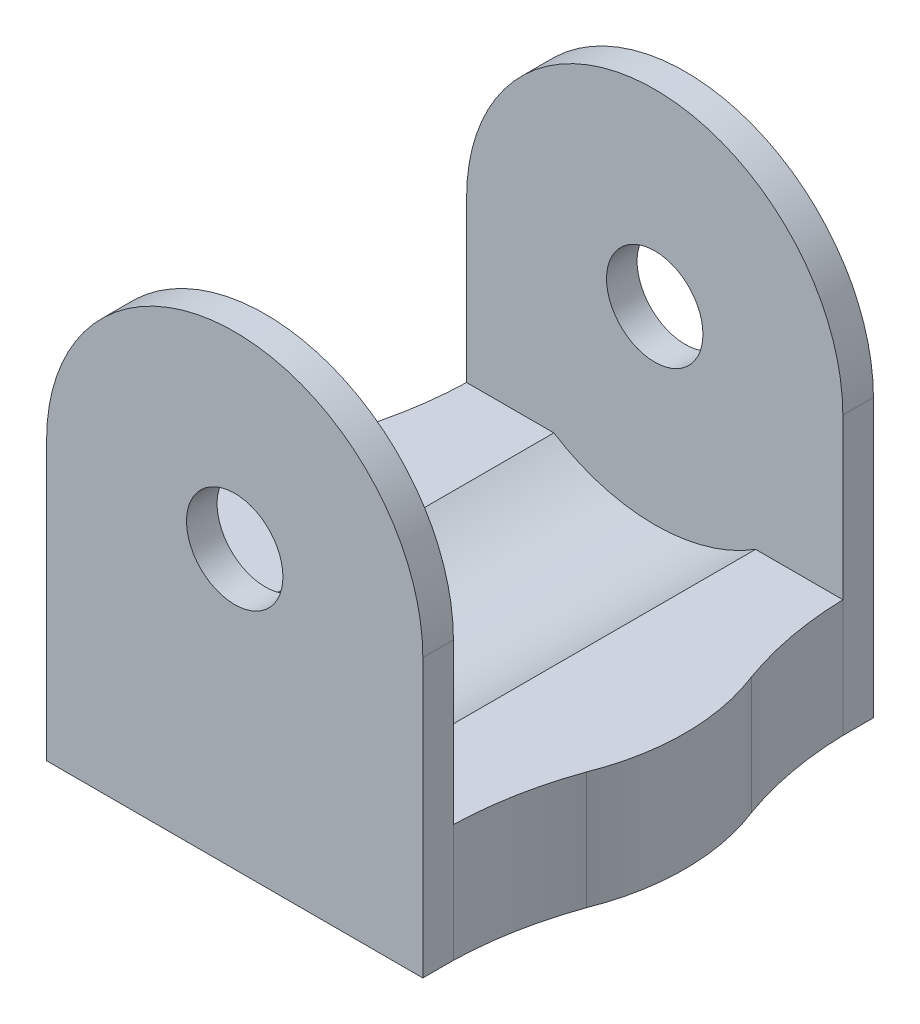
ISO-10303-21;
HEADER;
FILE_DESCRIPTION(('STEP AP214'),'2;1');
FILE_NAME('part.step','',(''),(''),'','','');
FILE_SCHEMA(('AUTOMOTIVE_DESIGN { 1 0 10303 214 1 1 1 1 }'));
ENDSEC;
DATA;
#1=APPLICATION_CONTEXT('core data for automotive mechanical design processes');
#2=APPLICATION_PROTOCOL_DEFINITION('international standard','automotive_design',2000,#1);
#3=PRODUCT_CONTEXT('',#1,'mechanical');
#4=PRODUCT('Part','Part','',(#3));
#5=PRODUCT_RELATED_PRODUCT_CATEGORY('part','',(#4));
#6=PRODUCT_DEFINITION_FORMATION('','',#4);
#7=PRODUCT_DEFINITION_CONTEXT('part definition',#1,'design');
#8=PRODUCT_DEFINITION('design','',#6,#7);
#9=PRODUCT_DEFINITION_SHAPE('','',#8);
#10=(LENGTH_UNIT() NAMED_UNIT(*) SI_UNIT(.MILLI.,.METRE.));
#11=(NAMED_UNIT(*) PLANE_ANGLE_UNIT() SI_UNIT($,.RADIAN.));
#12=(NAMED_UNIT(*) SI_UNIT($,.STERADIAN.) SOLID_ANGLE_UNIT());
#13=UNCERTAINTY_MEASURE_WITH_UNIT(LENGTH_MEASURE(1.E-05),#10,'distance_accuracy_value','');
#14=(GEOMETRIC_REPRESENTATION_CONTEXT(3) GLOBAL_UNCERTAINTY_ASSIGNED_CONTEXT((#13)) GLOBAL_UNIT_ASSIGNED_CONTEXT((#10,
#11,#12)) REPRESENTATION_CONTEXT('',''));
#15=CARTESIAN_POINT('',(0.,0.,0.));
#16=DIRECTION('',(0.,0.,1.));
#17=DIRECTION('',(1.,0.,0.));
#18=AXIS2_PLACEMENT_3D('',#15,#16,#17);
#19=CARTESIAN_POINT('',(0.,25.,0.));
#20=DIRECTION('',(0.,1.,0.));
#21=DIRECTION('',(0.,0.,1.));
#22=AXIS2_PLACEMENT_3D('',#19,#20,#21);
#23=PLANE('',#22);
#24=DIRECTION('',(-1.,0.,0.));
#25=VECTOR('',#24,1.);
#26=CARTESIAN_POINT('',(0.,25.,-41.4));
#27=LINE('',#26,#25);
#28=CARTESIAN_POINT('',(40.,25.,-41.4));
#29=VERTEX_POINT('',#28);
#30=CARTESIAN_POINT('',(21.4485430740645,25.,-41.4));
#31=VERTEX_POINT('',#30);
#32=EDGE_CURVE('E190',#29,#31,#27,.T.);
#33=ORIENTED_EDGE('',*,*,#32,.T.);
#34=DIRECTION('',(0.,0.,1.));
#35=VECTOR('',#34,1.);
#36=CARTESIAN_POINT('',(21.4485430740645,25.,-3.6));
#37=LINE('',#36,#35);
#38=CARTESIAN_POINT('',(21.4485430740645,25.,41.4));
#39=VERTEX_POINT('',#38);
#40=EDGE_CURVE('E179',#31,#39,#37,.T.);
#41=ORIENTED_EDGE('',*,*,#40,.T.);
#42=DIRECTION('',(1.,0.,0.));
#43=VECTOR('',#42,1.);
#44=CARTESIAN_POINT('',(0.,25.,41.4));
#45=LINE('',#44,#43);
#46=CARTESIAN_POINT('',(40.,25.,41.4));
#47=VERTEX_POINT('',#46);
#48=EDGE_CURVE('E49',#39,#47,#45,.T.);
#49=ORIENTED_EDGE('',*,*,#48,.T.);
#50=CARTESIAN_POINT('',(116.446057787122,25.,43.3606903082571));
#51=DIRECTION('',(0.,1.,0.));
#52=DIRECTION('',(0.,0.,1.));
#53=AXIS2_PLACEMENT_3D('',#50,#51,#52);
#54=CIRCLE('',#53,76.4711975692611);
#55=CARTESIAN_POINT('',(44.46961172075,25.,17.5297927371016));
#56=VERTEX_POINT('',#55);
#57=EDGE_CURVE('E211',#47,#56,#54,.F.);
#58=ORIENTED_EDGE('',*,*,#57,.T.);
#59=CARTESIAN_POINT('',(0.,25.,0.));
#60=DIRECTION('',(0.,1.,0.));
#61=DIRECTION('',(0.,0.,1.));
#62=AXIS2_PLACEMENT_3D('',#59,#60,#61);
#63=CIRCLE('',#62,47.8);
#64=CARTESIAN_POINT('',(44.46961172075,25.,-17.5297927371016));
#65=VERTEX_POINT('',#64);
#66=EDGE_CURVE('E275',#56,#65,#63,.T.);
#67=ORIENTED_EDGE('',*,*,#66,.T.);
#68=CARTESIAN_POINT('',(116.446057787122,25.,-43.3606903082571));
#69=DIRECTION('',(0.,-1.,0.));
#70=DIRECTION('',(0.,0.,-1.));
#71=AXIS2_PLACEMENT_3D('',#68,#69,#70);
#72=CIRCLE('',#71,76.4711975692611);
#73=EDGE_CURVE('E199',#29,#65,#72,.F.);
#74=ORIENTED_EDGE('',*,*,#73,.F.);
#75=EDGE_LOOP('',(#33,#41,#49,#58,#67,#74));
#76=FACE_BOUND('',#75,.T.);
#77=ADVANCED_FACE('F41',(#76),#23,.T.);
#78=DIRECTION('',(0.,0.,1.));
#79=VECTOR('',#78,1.);
#80=CARTESIAN_POINT('',(-21.4485430740645,25.,-3.6));
#81=LINE('',#80,#79);
#82=CARTESIAN_POINT('',(-21.4485430740645,25.,41.4));
#83=VERTEX_POINT('',#82);
#84=CARTESIAN_POINT('',(-21.4485430740645,25.,-41.4));
#85=VERTEX_POINT('',#84);
#86=EDGE_CURVE('E186',#83,#85,#81,.F.);
#87=ORIENTED_EDGE('',*,*,#86,.T.);
#88=CARTESIAN_POINT('',(-40.,25.,-41.4));
#89=VERTEX_POINT('',#88);
#90=EDGE_CURVE('E193',#85,#89,#27,.T.);
#91=ORIENTED_EDGE('',*,*,#90,.T.);
#92=CARTESIAN_POINT('',(-116.446057787122,25.,-43.3606903082571));
#93=DIRECTION('',(0.,-1.,0.));
#94=DIRECTION('',(0.,0.,-1.));
#95=AXIS2_PLACEMENT_3D('',#92,#93,#94);
#96=CIRCLE('',#95,76.4711975692611);
#97=CARTESIAN_POINT('',(-44.46961172075,25.,-17.5297927371016));
#98=VERTEX_POINT('',#97);
#99=EDGE_CURVE('E205',#89,#98,#96,.T.);
#100=ORIENTED_EDGE('',*,*,#99,.T.);
#101=CARTESIAN_POINT('',(-44.46961172075,25.,17.5297927371016));
#102=VERTEX_POINT('',#101);
#103=EDGE_CURVE('E274',#98,#102,#63,.T.);
#104=ORIENTED_EDGE('',*,*,#103,.T.);
#105=CARTESIAN_POINT('',(-116.446057787122,25.,43.3606903082571));
#106=DIRECTION('',(0.,1.,0.));
#107=DIRECTION('',(0.,0.,1.));
#108=AXIS2_PLACEMENT_3D('',#105,#106,#107);
#109=CIRCLE('',#108,76.4711975692611);
#110=CARTESIAN_POINT('',(-40.,25.,41.4));
#111=VERTEX_POINT('',#110);
#112=EDGE_CURVE('E220',#111,#102,#109,.T.);
#113=ORIENTED_EDGE('',*,*,#112,.F.);
#114=EDGE_CURVE('E11',#111,#83,#45,.T.);
#115=ORIENTED_EDGE('',*,*,#114,.T.);
#116=EDGE_LOOP('',(#87,#91,#100,#104,#113,#115));
#117=FACE_BOUND('',#116,.T.);
#118=ADVANCED_FACE('F303',(#117),#23,.T.);
#119=CARTESIAN_POINT('',(0.,15.,0.));
#120=DIRECTION('',(0.,-1.,0.));
#121=DIRECTION('',(0.,0.,-1.));
#122=AXIS2_PLACEMENT_3D('',#119,#120,#121);
#123=CYLINDRICAL_SURFACE('',#122,41.5);
#124=CARTESIAN_POINT('',(0.,15.,0.));
#125=DIRECTION('',(0.,1.,0.));
#126=DIRECTION('',(0.,0.,1.));
#127=AXIS2_PLACEMENT_3D('',#124,#125,#126);
#128=CIRCLE('',#127,41.5);
#129=CARTESIAN_POINT('',(2.87923600977763,15.,41.4));
#130=VERTEX_POINT('',#129);
#131=CARTESIAN_POINT('',(2.87923600977763,15.,-41.4));
#132=VERTEX_POINT('',#131);
#133=EDGE_CURVE('E278',#130,#132,#128,.T.);
#134=ORIENTED_EDGE('',*,*,#133,.T.);
#135=DIRECTION('',(0.,-1.,0.));
#136=VECTOR('',#135,1.);
#137=CARTESIAN_POINT('',(2.87923600977763,15.,-41.4));
#138=LINE('',#137,#136);
#139=CARTESIAN_POINT('',(2.87923600977763,0.,-41.4));
#140=VERTEX_POINT('',#139);
#141=EDGE_CURVE('E353',#132,#140,#138,.T.);
#142=ORIENTED_EDGE('',*,*,#141,.T.);
#143=CARTESIAN_POINT('',(0.,0.,0.));
#144=DIRECTION('',(0.,1.,0.));
#145=DIRECTION('',(0.,0.,1.));
#146=AXIS2_PLACEMENT_3D('',#143,#144,#145);
#147=CIRCLE('',#146,41.5);
#148=CARTESIAN_POINT('',(2.87923600977763,0.,41.4));
#149=VERTEX_POINT('',#148);
#150=EDGE_CURVE('E281',#149,#140,#147,.T.);
#151=ORIENTED_EDGE('',*,*,#150,.F.);
#152=DIRECTION('',(0.,-1.,0.));
#153=VECTOR('',#152,1.);
#154=CARTESIAN_POINT('',(2.87923600977763,15.,41.4));
#155=LINE('',#154,#153);
#156=EDGE_CURVE('E268',#149,#130,#155,.F.);
#157=ORIENTED_EDGE('',*,*,#156,.T.);
#158=EDGE_LOOP('',(#134,#142,#151,#157));
#159=FACE_BOUND('',#158,.T.);
#160=ADVANCED_FACE('F417',(#159),#123,.F.);
#161=CARTESIAN_POINT('',(-2.87923600977763,0.,-41.4));
#162=VERTEX_POINT('',#161);
#163=CARTESIAN_POINT('',(-2.87923600977763,0.,41.4));
#164=VERTEX_POINT('',#163);
#165=EDGE_CURVE('E280',#162,#164,#147,.T.);
#166=ORIENTED_EDGE('',*,*,#165,.F.);
#167=DIRECTION('',(0.,-1.,0.));
#168=VECTOR('',#167,1.);
#169=CARTESIAN_POINT('',(-2.87923600977763,15.,-41.4));
#170=LINE('',#169,#168);
#171=CARTESIAN_POINT('',(-2.87923600977763,15.,-41.4));
#172=VERTEX_POINT('',#171);
#173=EDGE_CURVE('E350',#162,#172,#170,.F.);
#174=ORIENTED_EDGE('',*,*,#173,.T.);
#175=CARTESIAN_POINT('',(-2.87923600977763,15.,41.4));
#176=VERTEX_POINT('',#175);
#177=EDGE_CURVE('E277',#172,#176,#128,.T.);
#178=ORIENTED_EDGE('',*,*,#177,.T.);
#179=DIRECTION('',(0.,-1.,0.));
#180=VECTOR('',#179,1.);
#181=CARTESIAN_POINT('',(-2.87923600977763,15.,41.4));
#182=LINE('',#181,#180);
#183=EDGE_CURVE('E271',#176,#164,#182,.T.);
#184=ORIENTED_EDGE('',*,*,#183,.T.);
#185=EDGE_LOOP('',(#166,#174,#178,#184));
#186=FACE_BOUND('',#185,.T.);
#187=ADVANCED_FACE('F425',(#186),#123,.F.);
#188=CARTESIAN_POINT('',(0.,15.,0.));
#189=DIRECTION('',(0.,1.,0.));
#190=DIRECTION('',(0.,0.,1.));
#191=AXIS2_PLACEMENT_3D('',#188,#189,#190);
#192=PLANE('',#191);
#193=DIRECTION('',(-1.,0.,0.));
#194=VECTOR('',#193,1.);
#195=CARTESIAN_POINT('',(0.,15.,-41.4));
#196=LINE('',#195,#194);
#197=EDGE_CURVE('E64',#132,#172,#196,.T.);
#198=ORIENTED_EDGE('',*,*,#197,.F.);
#199=ORIENTED_EDGE('',*,*,#133,.F.);
#200=DIRECTION('',(1.,0.,0.));
#201=VECTOR('',#200,1.);
#202=CARTESIAN_POINT('',(0.,15.,41.4));
#203=LINE('',#202,#201);
#204=EDGE_CURVE('E265',#176,#130,#203,.T.);
#205=ORIENTED_EDGE('',*,*,#204,.F.);
#206=ORIENTED_EDGE('',*,*,#177,.F.);
#207=EDGE_LOOP('',(#198,#199,#205,#206));
#208=FACE_BOUND('',#207,.T.);
#209=ADVANCED_FACE('F422',(#208),#192,.F.);
#210=CARTESIAN_POINT('',(0.,15.,0.));
#211=DIRECTION('',(0.,-1.,0.));
#212=DIRECTION('',(0.,0.,-1.));
#213=AXIS2_PLACEMENT_3D('',#210,#211,#212);
#214=CYLINDRICAL_SURFACE('',#213,47.8);
#215=DIRECTION('',(0.,1.,0.));
#216=VECTOR('',#215,1.);
#217=CARTESIAN_POINT('',(44.46961172075,0.,-17.5297927371016));
#218=LINE('',#217,#216);
#219=CARTESIAN_POINT('',(44.46961172075,0.,-17.5297927371016));
#220=VERTEX_POINT('',#219);
#221=EDGE_CURVE('E357',#220,#65,#218,.T.);
#222=ORIENTED_EDGE('',*,*,#221,.T.);
#223=ORIENTED_EDGE('',*,*,#66,.F.);
#224=DIRECTION('',(0.,1.,0.));
#225=VECTOR('',#224,1.);
#226=CARTESIAN_POINT('',(44.46961172075,0.,17.5297927371016));
#227=LINE('',#226,#225);
#228=CARTESIAN_POINT('',(44.46961172075,0.,17.5297927371016));
#229=VERTEX_POINT('',#228);
#230=EDGE_CURVE('E216',#229,#56,#227,.T.);
#231=ORIENTED_EDGE('',*,*,#230,.F.);
#232=CARTESIAN_POINT('',(0.,0.,0.));
#233=DIRECTION('',(0.,1.,0.));
#234=DIRECTION('',(0.,0.,1.));
#235=AXIS2_PLACEMENT_3D('',#232,#233,#234);
#236=CIRCLE('',#235,47.8);
#237=EDGE_CURVE('E284',#229,#220,#236,.T.);
#238=ORIENTED_EDGE('',*,*,#237,.T.);
#239=EDGE_LOOP('',(#222,#223,#231,#238));
#240=FACE_BOUND('',#239,.T.);
#241=ADVANCED_FACE('F43',(#240),#214,.T.);
#242=ORIENTED_EDGE('',*,*,#103,.F.);
#243=DIRECTION('',(0.,1.,0.));
#244=VECTOR('',#243,1.);
#245=CARTESIAN_POINT('',(-44.46961172075,0.,-17.5297927371016));
#246=LINE('',#245,#244);
#247=CARTESIAN_POINT('',(-44.46961172075,0.,-17.5297927371016));
#248=VERTEX_POINT('',#247);
#249=EDGE_CURVE('E203',#248,#98,#246,.T.);
#250=ORIENTED_EDGE('',*,*,#249,.F.);
#251=CARTESIAN_POINT('',(-44.46961172075,0.,17.5297927371016));
#252=VERTEX_POINT('',#251);
#253=EDGE_CURVE('E283',#248,#252,#236,.T.);
#254=ORIENTED_EDGE('',*,*,#253,.T.);
#255=DIRECTION('',(0.,1.,0.));
#256=VECTOR('',#255,1.);
#257=CARTESIAN_POINT('',(-44.46961172075,0.,17.5297927371016));
#258=LINE('',#257,#256);
#259=EDGE_CURVE('E227',#252,#102,#258,.T.);
#260=ORIENTED_EDGE('',*,*,#259,.T.);
#261=EDGE_LOOP('',(#242,#250,#254,#260));
#262=FACE_BOUND('',#261,.T.);
#263=ADVANCED_FACE('F291',(#262),#214,.T.);
#264=CARTESIAN_POINT('',(0.,0.,0.));
#265=DIRECTION('',(0.,1.,0.));
#266=DIRECTION('',(0.,0.,1.));
#267=AXIS2_PLACEMENT_3D('',#264,#265,#266);
#268=PLANE('',#267);
#269=ORIENTED_EDGE('',*,*,#150,.T.);
#270=DIRECTION('',(1.,0.,0.));
#271=VECTOR('',#270,1.);
#272=CARTESIAN_POINT('',(40.,0.,-41.4));
#273=LINE('',#272,#271);
#274=EDGE_CURVE('E339',#162,#140,#273,.T.);
#275=ORIENTED_EDGE('',*,*,#274,.F.);
#276=ORIENTED_EDGE('',*,*,#165,.T.);
#277=DIRECTION('',(1.,0.,0.));
#278=VECTOR('',#277,1.);
#279=CARTESIAN_POINT('',(40.,0.,41.4));
#280=LINE('',#279,#278);
#281=EDGE_CURVE('E248',#164,#149,#280,.T.);
#282=ORIENTED_EDGE('',*,*,#281,.T.);
#283=EDGE_LOOP('',(#269,#275,#276,#282));
#284=FACE_BOUND('',#283,.T.);
#285=CARTESIAN_POINT('',(-116.446057787122,0.,-43.3606903082571));
#286=DIRECTION('',(0.,-1.,0.));
#287=DIRECTION('',(0.,0.,-1.));
#288=AXIS2_PLACEMENT_3D('',#285,#286,#287);
#289=CIRCLE('',#288,76.4711975692611);
#290=CARTESIAN_POINT('',(-40.,0.,-41.4));
#291=VERTEX_POINT('',#290);
#292=EDGE_CURVE('E200',#291,#248,#289,.T.);
#293=ORIENTED_EDGE('',*,*,#292,.F.);
#294=DIRECTION('',(0.,0.,1.));
#295=VECTOR('',#294,1.);
#296=CARTESIAN_POINT('',(-40.,0.,-47.9));
#297=LINE('',#296,#295);
#298=CARTESIAN_POINT('',(-40.,0.,-47.9));
#299=VERTEX_POINT('',#298);
#300=EDGE_CURVE('E310',#299,#291,#297,.T.);
#301=ORIENTED_EDGE('',*,*,#300,.F.);
#302=DIRECTION('',(1.,0.,0.));
#303=VECTOR('',#302,1.);
#304=CARTESIAN_POINT('',(40.,0.,-47.9));
#305=LINE('',#304,#303);
#306=CARTESIAN_POINT('',(40.,0.,-47.9));
#307=VERTEX_POINT('',#306);
#308=EDGE_CURVE('E312',#299,#307,#305,.T.);
#309=ORIENTED_EDGE('',*,*,#308,.T.);
#310=DIRECTION('',(0.,0.,1.));
#311=VECTOR('',#310,1.);
#312=CARTESIAN_POINT('',(40.,0.,-47.9));
#313=LINE('',#312,#311);
#314=CARTESIAN_POINT('',(40.,0.,-41.4));
#315=VERTEX_POINT('',#314);
#316=EDGE_CURVE('E315',#307,#315,#313,.T.);
#317=ORIENTED_EDGE('',*,*,#316,.T.);
#318=CARTESIAN_POINT('',(116.446057787122,0.,-43.3606903082571));
#319=DIRECTION('',(0.,-1.,0.));
#320=DIRECTION('',(0.,0.,-1.));
#321=AXIS2_PLACEMENT_3D('',#318,#319,#320);
#322=CIRCLE('',#321,76.4711975692611);
#323=EDGE_CURVE('E355',#315,#220,#322,.F.);
#324=ORIENTED_EDGE('',*,*,#323,.T.);
#325=ORIENTED_EDGE('',*,*,#237,.F.);
#326=CARTESIAN_POINT('',(116.446057787122,0.,43.3606903082571));
#327=DIRECTION('',(0.,1.,0.));
#328=DIRECTION('',(0.,0.,1.));
#329=AXIS2_PLACEMENT_3D('',#326,#327,#328);
#330=CIRCLE('',#329,76.4711975692611);
#331=CARTESIAN_POINT('',(40.,0.,41.4));
#332=VERTEX_POINT('',#331);
#333=EDGE_CURVE('E214',#332,#229,#330,.F.);
#334=ORIENTED_EDGE('',*,*,#333,.F.);
#335=DIRECTION('',(0.,0.,-1.));
#336=VECTOR('',#335,1.);
#337=CARTESIAN_POINT('',(40.,0.,47.9));
#338=LINE('',#337,#336);
#339=CARTESIAN_POINT('',(40.,0.,47.9));
#340=VERTEX_POINT('',#339);
#341=EDGE_CURVE('E256',#340,#332,#338,.T.);
#342=ORIENTED_EDGE('',*,*,#341,.F.);
#343=DIRECTION('',(1.,0.,0.));
#344=VECTOR('',#343,1.);
#345=CARTESIAN_POINT('',(40.,0.,47.9));
#346=LINE('',#345,#344);
#347=CARTESIAN_POINT('',(-40.,0.,47.9));
#348=VERTEX_POINT('',#347);
#349=EDGE_CURVE('E239',#348,#340,#346,.T.);
#350=ORIENTED_EDGE('',*,*,#349,.F.);
#351=DIRECTION('',(0.,0.,-1.));
#352=VECTOR('',#351,1.);
#353=CARTESIAN_POINT('',(-40.,0.,47.9));
#354=LINE('',#353,#352);
#355=CARTESIAN_POINT('',(-40.,0.,41.4));
#356=VERTEX_POINT('',#355);
#357=EDGE_CURVE('E259',#348,#356,#354,.T.);
#358=ORIENTED_EDGE('',*,*,#357,.T.);
#359=CARTESIAN_POINT('',(-116.446057787122,0.,43.3606903082571));
#360=DIRECTION('',(0.,1.,0.));
#361=DIRECTION('',(0.,0.,1.));
#362=AXIS2_PLACEMENT_3D('',#359,#360,#361);
#363=CIRCLE('',#362,76.4711975692611);
#364=EDGE_CURVE('E221',#356,#252,#363,.T.);
#365=ORIENTED_EDGE('',*,*,#364,.T.);
#366=ORIENTED_EDGE('',*,*,#253,.F.);
#367=EDGE_LOOP('',(#293,#301,#309,#317,#324,#325,#334,#342,#350,#358,#365,#366));
#368=FACE_BOUND('',#367,.T.);
#369=ADVANCED_FACE('F295',(#284,#368),#268,.F.);
#370=CARTESIAN_POINT('',(0.,59.,47.9));
#371=DIRECTION('',(0.,0.,1.));
#372=DIRECTION('',(1.,0.,0.));
#373=AXIS2_PLACEMENT_3D('',#370,#371,#372);
#374=PLANE('',#373);
#375=CARTESIAN_POINT('',(0.,59.,47.9));
#376=DIRECTION('',(0.,0.,1.));
#377=DIRECTION('',(1.,0.,0.));
#378=AXIS2_PLACEMENT_3D('',#375,#376,#377);
#379=CIRCLE('',#378,10.25);
#380=CARTESIAN_POINT('',(10.25,59.,47.9));
#381=VERTEX_POINT('',#380);
#382=EDGE_CURVE('E384',#381,#381,#379,.T.);
#383=ORIENTED_EDGE('',*,*,#382,.F.);
#384=EDGE_LOOP('',(#383));
#385=FACE_BOUND('',#384,.T.);
#386=CARTESIAN_POINT('',(0.,59.,47.9));
#387=DIRECTION('',(0.,0.,1.));
#388=DIRECTION('',(1.,0.,0.));
#389=AXIS2_PLACEMENT_3D('',#386,#387,#388);
#390=CIRCLE('',#389,40.);
#391=CARTESIAN_POINT('',(40.,59.,47.9));
#392=VERTEX_POINT('',#391);
#393=CARTESIAN_POINT('',(-40.,59.,47.9));
#394=VERTEX_POINT('',#393);
#395=EDGE_CURVE('E233',#392,#394,#390,.T.);
#396=ORIENTED_EDGE('',*,*,#395,.T.);
#397=DIRECTION('',(0.,-1.,0.));
#398=VECTOR('',#397,1.);
#399=CARTESIAN_POINT('',(-40.,59.,47.9));
#400=LINE('',#399,#398);
#401=EDGE_CURVE('E236',#394,#348,#400,.T.);
#402=ORIENTED_EDGE('',*,*,#401,.T.);
#403=ORIENTED_EDGE('',*,*,#349,.T.);
#404=DIRECTION('',(0.,1.,0.));
#405=VECTOR('',#404,1.);
#406=CARTESIAN_POINT('',(40.,59.,47.9));
#407=LINE('',#406,#405);
#408=EDGE_CURVE('E241',#340,#392,#407,.T.);
#409=ORIENTED_EDGE('',*,*,#408,.T.);
#410=EDGE_LOOP('',(#396,#402,#403,#409));
#411=FACE_BOUND('',#410,.T.);
#412=ADVANCED_FACE('F429',(#385,#411),#374,.T.);
#413=CARTESIAN_POINT('',(40.,59.,47.9));
#414=DIRECTION('',(-1.,0.,0.));
#415=DIRECTION('',(0.,-1.,0.));
#416=AXIS2_PLACEMENT_3D('',#413,#414,#415);
#417=PLANE('',#416);
#418=DIRECTION('',(0.,1.,0.));
#419=VECTOR('',#418,1.);
#420=CARTESIAN_POINT('',(40.,59.,41.4));
#421=LINE('',#420,#419);
#422=EDGE_CURVE('E237',#332,#47,#421,.T.);
#423=ORIENTED_EDGE('',*,*,#422,.T.);
#424=CARTESIAN_POINT('',(40.,59.,41.4));
#425=VERTEX_POINT('',#424);
#426=EDGE_CURVE('E251',#47,#425,#421,.T.);
#427=ORIENTED_EDGE('',*,*,#426,.T.);
#428=DIRECTION('',(0.,0.,-1.));
#429=VECTOR('',#428,1.);
#430=CARTESIAN_POINT('',(40.,59.,47.9));
#431=LINE('',#430,#429);
#432=EDGE_CURVE('E243',#392,#425,#431,.T.);
#433=ORIENTED_EDGE('',*,*,#432,.F.);
#434=ORIENTED_EDGE('',*,*,#408,.F.);
#435=ORIENTED_EDGE('',*,*,#341,.T.);
#436=EDGE_LOOP('',(#423,#427,#433,#434,#435));
#437=FACE_BOUND('',#436,.T.);
#438=ADVANCED_FACE('F435',(#437),#417,.F.);
#439=CARTESIAN_POINT('',(-40.,59.,47.9));
#440=DIRECTION('',(1.,0.,0.));
#441=DIRECTION('',(0.,0.,-1.));
#442=AXIS2_PLACEMENT_3D('',#439,#440,#441);
#443=PLANE('',#442);
#444=DIRECTION('',(0.,-1.,0.));
#445=VECTOR('',#444,1.);
#446=CARTESIAN_POINT('',(-40.,59.,41.4));
#447=LINE('',#446,#445);
#448=CARTESIAN_POINT('',(-40.,59.,41.4));
#449=VERTEX_POINT('',#448);
#450=EDGE_CURVE('E246',#449,#111,#447,.T.);
#451=ORIENTED_EDGE('',*,*,#450,.T.);
#452=DIRECTION('',(0.,1.,0.));
#453=VECTOR('',#452,1.);
#454=CARTESIAN_POINT('',(-40.,0.,41.4));
#455=LINE('',#454,#453);
#456=EDGE_CURVE('E224',#356,#111,#455,.T.);
#457=ORIENTED_EDGE('',*,*,#456,.F.);
#458=ORIENTED_EDGE('',*,*,#357,.F.);
#459=ORIENTED_EDGE('',*,*,#401,.F.);
#460=DIRECTION('',(0.,0.,-1.));
#461=VECTOR('',#460,1.);
#462=CARTESIAN_POINT('',(-40.,59.,47.9));
#463=LINE('',#462,#461);
#464=EDGE_CURVE('E262',#394,#449,#463,.T.);
#465=ORIENTED_EDGE('',*,*,#464,.T.);
#466=EDGE_LOOP('',(#451,#457,#458,#459,#465));
#467=FACE_BOUND('',#466,.T.);
#468=ADVANCED_FACE('F461',(#467),#443,.F.);
#469=CARTESIAN_POINT('',(0.,59.,47.9));
#470=DIRECTION('',(0.,0.,-1.));
#471=DIRECTION('',(-1.,0.,0.));
#472=AXIS2_PLACEMENT_3D('',#469,#470,#471);
#473=CYLINDRICAL_SURFACE('',#472,40.);
#474=CARTESIAN_POINT('',(0.,59.,41.4));
#475=DIRECTION('',(0.,0.,1.));
#476=DIRECTION('',(1.,0.,0.));
#477=AXIS2_PLACEMENT_3D('',#474,#475,#476);
#478=CIRCLE('',#477,40.);
#479=EDGE_CURVE('E230',#425,#449,#478,.T.);
#480=ORIENTED_EDGE('',*,*,#479,.T.);
#481=ORIENTED_EDGE('',*,*,#464,.F.);
#482=ORIENTED_EDGE('',*,*,#395,.F.);
#483=ORIENTED_EDGE('',*,*,#432,.T.);
#484=EDGE_LOOP('',(#480,#481,#482,#483));
#485=FACE_BOUND('',#484,.T.);
#486=ADVANCED_FACE('F420',(#485),#473,.T.);
#487=CARTESIAN_POINT('',(0.,59.,41.4));
#488=DIRECTION('',(0.,0.,1.));
#489=DIRECTION('',(1.,0.,0.));
#490=AXIS2_PLACEMENT_3D('',#487,#488,#489);
#491=PLANE('',#490);
#492=CARTESIAN_POINT('',(0.,59.,41.4));
#493=DIRECTION('',(0.,0.,1.));
#494=DIRECTION('',(1.,0.,0.));
#495=AXIS2_PLACEMENT_3D('',#492,#493,#494);
#496=CIRCLE('',#495,10.25);
#497=CARTESIAN_POINT('',(10.25,59.,41.4));
#498=VERTEX_POINT('',#497);
#499=EDGE_CURVE('E194',#498,#498,#496,.T.);
#500=ORIENTED_EDGE('',*,*,#499,.T.);
#501=EDGE_LOOP('',(#500));
#502=FACE_BOUND('',#501,.T.);
#503=ORIENTED_EDGE('',*,*,#114,.F.);
#504=ORIENTED_EDGE('',*,*,#450,.F.);
#505=ORIENTED_EDGE('',*,*,#479,.F.);
#506=ORIENTED_EDGE('',*,*,#426,.F.);
#507=ORIENTED_EDGE('',*,*,#48,.F.);
#508=CARTESIAN_POINT('',(0.,59.,41.4));
#509=DIRECTION('',(0.,0.,-1.));
#510=DIRECTION('',(-1.,0.,0.));
#511=AXIS2_PLACEMENT_3D('',#508,#509,#510);
#512=CIRCLE('',#511,40.2);
#513=EDGE_CURVE('E56',#39,#83,#512,.T.);
#514=ORIENTED_EDGE('',*,*,#513,.T.);
#515=EDGE_LOOP('',(#503,#504,#505,#506,#507,#514));
#516=FACE_BOUND('',#515,.T.);
#517=ADVANCED_FACE('F450',(#502,#516),#491,.F.);
#518=ORIENTED_EDGE('',*,*,#183,.F.);
#519=ORIENTED_EDGE('',*,*,#204,.T.);
#520=ORIENTED_EDGE('',*,*,#156,.F.);
#521=ORIENTED_EDGE('',*,*,#281,.F.);
#522=EDGE_LOOP('',(#518,#519,#520,#521));
#523=FACE_BOUND('',#522,.T.);
#524=ADVANCED_FACE('F448',(#523),#491,.F.);
#525=CARTESIAN_POINT('',(-116.446057787122,0.,43.3606903082571));
#526=DIRECTION('',(0.,1.,0.));
#527=DIRECTION('',(0.,0.,1.));
#528=AXIS2_PLACEMENT_3D('',#525,#526,#527);
#529=CYLINDRICAL_SURFACE('',#528,76.4711975692611);
#530=ORIENTED_EDGE('',*,*,#112,.T.);
#531=ORIENTED_EDGE('',*,*,#259,.F.);
#532=ORIENTED_EDGE('',*,*,#364,.F.);
#533=ORIENTED_EDGE('',*,*,#456,.T.);
#534=EDGE_LOOP('',(#530,#531,#532,#533));
#535=FACE_BOUND('',#534,.T.);
#536=ADVANCED_FACE('F300',(#535),#529,.F.);
#537=CARTESIAN_POINT('',(116.446057787122,0.,43.3606903082571));
#538=DIRECTION('',(0.,1.,0.));
#539=DIRECTION('',(0.,0.,1.));
#540=AXIS2_PLACEMENT_3D('',#537,#538,#539);
#541=CYLINDRICAL_SURFACE('',#540,76.4711975692611);
#542=ORIENTED_EDGE('',*,*,#57,.F.);
#543=ORIENTED_EDGE('',*,*,#422,.F.);
#544=ORIENTED_EDGE('',*,*,#333,.T.);
#545=ORIENTED_EDGE('',*,*,#230,.T.);
#546=EDGE_LOOP('',(#542,#543,#544,#545));
#547=FACE_BOUND('',#546,.T.);
#548=ADVANCED_FACE('F456',(#547),#541,.F.);
#549=CARTESIAN_POINT('',(-116.446057787122,0.,-43.3606903082571));
#550=DIRECTION('',(0.,1.,0.));
#551=DIRECTION('',(0.,0.,1.));
#552=AXIS2_PLACEMENT_3D('',#549,#550,#551);
#553=CYLINDRICAL_SURFACE('',#552,76.4711975692611);
#554=ORIENTED_EDGE('',*,*,#99,.F.);
#555=DIRECTION('',(0.,1.,0.));
#556=VECTOR('',#555,1.);
#557=CARTESIAN_POINT('',(-40.,0.,-41.4));
#558=LINE('',#557,#556);
#559=EDGE_CURVE('E208',#291,#89,#558,.T.);
#560=ORIENTED_EDGE('',*,*,#559,.F.);
#561=ORIENTED_EDGE('',*,*,#292,.T.);
#562=ORIENTED_EDGE('',*,*,#249,.T.);
#563=EDGE_LOOP('',(#554,#560,#561,#562));
#564=FACE_BOUND('',#563,.T.);
#565=ADVANCED_FACE('F307',(#564),#553,.F.);
#566=CARTESIAN_POINT('',(116.446057787122,0.,-43.3606903082571));
#567=DIRECTION('',(0.,1.,0.));
#568=DIRECTION('',(0.,0.,1.));
#569=AXIS2_PLACEMENT_3D('',#566,#567,#568);
#570=CYLINDRICAL_SURFACE('',#569,76.4711975692611);
#571=ORIENTED_EDGE('',*,*,#73,.T.);
#572=ORIENTED_EDGE('',*,*,#221,.F.);
#573=ORIENTED_EDGE('',*,*,#323,.F.);
#574=DIRECTION('',(0.,1.,0.));
#575=VECTOR('',#574,1.);
#576=CARTESIAN_POINT('',(40.,0.,-41.4));
#577=LINE('',#576,#575);
#578=EDGE_CURVE('E359',#315,#29,#577,.T.);
#579=ORIENTED_EDGE('',*,*,#578,.T.);
#580=EDGE_LOOP('',(#571,#572,#573,#579));
#581=FACE_BOUND('',#580,.T.);
#582=ADVANCED_FACE('F367',(#581),#570,.F.);
#583=CARTESIAN_POINT('',(0.,59.,-41.4));
#584=DIRECTION('',(0.,0.,-1.));
#585=DIRECTION('',(1.,0.,0.));
#586=AXIS2_PLACEMENT_3D('',#583,#584,#585);
#587=PLANE('',#586);
#588=CARTESIAN_POINT('',(0.,59.,-41.4));
#589=DIRECTION('',(0.,0.,-1.));
#590=DIRECTION('',(-1.,0.,0.));
#591=AXIS2_PLACEMENT_3D('',#588,#589,#590);
#592=CIRCLE('',#591,10.25);
#593=CARTESIAN_POINT('',(-10.25,59.,-41.4));
#594=VERTEX_POINT('',#593);
#595=EDGE_CURVE('E380',#594,#594,#592,.T.);
#596=ORIENTED_EDGE('',*,*,#595,.T.);
#597=EDGE_LOOP('',(#596));
#598=FACE_BOUND('',#597,.T.);
#599=ORIENTED_EDGE('',*,*,#90,.F.);
#600=CARTESIAN_POINT('',(0.,59.,-41.4));
#601=DIRECTION('',(0.,0.,-1.));
#602=DIRECTION('',(-1.,0.,0.));
#603=AXIS2_PLACEMENT_3D('',#600,#601,#602);
#604=CIRCLE('',#603,40.2);
#605=EDGE_CURVE('E182',#31,#85,#604,.T.);
#606=ORIENTED_EDGE('',*,*,#605,.F.);
#607=ORIENTED_EDGE('',*,*,#32,.F.);
#608=DIRECTION('',(0.,1.,0.));
#609=VECTOR('',#608,1.);
#610=CARTESIAN_POINT('',(40.,59.,-41.4));
#611=LINE('',#610,#609);
#612=CARTESIAN_POINT('',(40.,59.,-41.4));
#613=VERTEX_POINT('',#612);
#614=EDGE_CURVE('E337',#29,#613,#611,.T.);
#615=ORIENTED_EDGE('',*,*,#614,.T.);
#616=CARTESIAN_POINT('',(0.,59.,-41.4));
#617=DIRECTION('',(0.,0.,1.));
#618=DIRECTION('',(1.,0.,0.));
#619=AXIS2_PLACEMENT_3D('',#616,#617,#618);
#620=CIRCLE('',#619,40.);
#621=CARTESIAN_POINT('',(-40.,59.,-41.4));
#622=VERTEX_POINT('',#621);
#623=EDGE_CURVE('E334',#613,#622,#620,.T.);
#624=ORIENTED_EDGE('',*,*,#623,.T.);
#625=DIRECTION('',(0.,-1.,0.));
#626=VECTOR('',#625,1.);
#627=CARTESIAN_POINT('',(-40.,59.,-41.4));
#628=LINE('',#627,#626);
#629=EDGE_CURVE('E342',#622,#89,#628,.T.);
#630=ORIENTED_EDGE('',*,*,#629,.T.);
#631=EDGE_LOOP('',(#599,#606,#607,#615,#624,#630));
#632=FACE_BOUND('',#631,.T.);
#633=ADVANCED_FACE('F189',(#598,#632),#587,.F.);
#634=CARTESIAN_POINT('',(0.,59.,-47.9));
#635=DIRECTION('',(0.,0.,-1.));
#636=DIRECTION('',(1.,0.,0.));
#637=AXIS2_PLACEMENT_3D('',#634,#635,#636);
#638=PLANE('',#637);
#639=CARTESIAN_POINT('',(0.,59.,-47.9));
#640=DIRECTION('',(0.,0.,1.));
#641=DIRECTION('',(1.,0.,0.));
#642=AXIS2_PLACEMENT_3D('',#639,#640,#641);
#643=CIRCLE('',#642,10.25);
#644=CARTESIAN_POINT('',(10.25,59.,-47.9));
#645=VERTEX_POINT('',#644);
#646=EDGE_CURVE('E383',#645,#645,#643,.T.);
#647=ORIENTED_EDGE('',*,*,#646,.T.);
#648=EDGE_LOOP('',(#647));
#649=FACE_BOUND('',#648,.T.);
#650=CARTESIAN_POINT('',(0.,59.,-47.9));
#651=DIRECTION('',(0.,0.,1.));
#652=DIRECTION('',(1.,0.,0.));
#653=AXIS2_PLACEMENT_3D('',#650,#651,#652);
#654=CIRCLE('',#653,40.);
#655=CARTESIAN_POINT('',(40.,59.,-47.9));
#656=VERTEX_POINT('',#655);
#657=CARTESIAN_POINT('',(-40.,59.,-47.9));
#658=VERTEX_POINT('',#657);
#659=EDGE_CURVE('E343',#656,#658,#654,.T.);
#660=ORIENTED_EDGE('',*,*,#659,.F.);
#661=DIRECTION('',(0.,1.,0.));
#662=VECTOR('',#661,1.);
#663=CARTESIAN_POINT('',(40.,59.,-47.9));
#664=LINE('',#663,#662);
#665=EDGE_CURVE('E325',#307,#656,#664,.T.);
#666=ORIENTED_EDGE('',*,*,#665,.F.);
#667=ORIENTED_EDGE('',*,*,#308,.F.);
#668=DIRECTION('',(0.,-1.,0.));
#669=VECTOR('',#668,1.);
#670=CARTESIAN_POINT('',(-40.,59.,-47.9));
#671=LINE('',#670,#669);
#672=EDGE_CURVE('E323',#658,#299,#671,.T.);
#673=ORIENTED_EDGE('',*,*,#672,.F.);
#674=EDGE_LOOP('',(#660,#666,#667,#673));
#675=FACE_BOUND('',#674,.T.);
#676=ADVANCED_FACE('F322',(#649,#675),#638,.T.);
#677=CARTESIAN_POINT('',(-40.,59.,-47.9));
#678=DIRECTION('',(-1.,0.,0.));
#679=DIRECTION('',(0.,0.,1.));
#680=AXIS2_PLACEMENT_3D('',#677,#678,#679);
#681=PLANE('',#680);
#682=ORIENTED_EDGE('',*,*,#629,.F.);
#683=DIRECTION('',(0.,0.,1.));
#684=VECTOR('',#683,1.);
#685=CARTESIAN_POINT('',(-40.,59.,-47.9));
#686=LINE('',#685,#684);
#687=EDGE_CURVE('E316',#658,#622,#686,.T.);
#688=ORIENTED_EDGE('',*,*,#687,.F.);
#689=ORIENTED_EDGE('',*,*,#672,.T.);
#690=ORIENTED_EDGE('',*,*,#300,.T.);
#691=ORIENTED_EDGE('',*,*,#559,.T.);
#692=EDGE_LOOP('',(#682,#688,#689,#690,#691));
#693=FACE_BOUND('',#692,.T.);
#694=ADVANCED_FACE('F328',(#693),#681,.T.);
#695=CARTESIAN_POINT('',(40.,59.,-47.9));
#696=DIRECTION('',(1.,0.,0.));
#697=DIRECTION('',(0.,1.,0.));
#698=AXIS2_PLACEMENT_3D('',#695,#696,#697);
#699=PLANE('',#698);
#700=ORIENTED_EDGE('',*,*,#578,.F.);
#701=ORIENTED_EDGE('',*,*,#316,.F.);
#702=ORIENTED_EDGE('',*,*,#665,.T.);
#703=DIRECTION('',(0.,0.,1.));
#704=VECTOR('',#703,1.);
#705=CARTESIAN_POINT('',(40.,59.,-47.9));
#706=LINE('',#705,#704);
#707=EDGE_CURVE('E346',#656,#613,#706,.T.);
#708=ORIENTED_EDGE('',*,*,#707,.T.);
#709=ORIENTED_EDGE('',*,*,#614,.F.);
#710=EDGE_LOOP('',(#700,#701,#702,#708,#709));
#711=FACE_BOUND('',#710,.T.);
#712=ADVANCED_FACE('F370',(#711),#699,.T.);
#713=CARTESIAN_POINT('',(0.,59.,-47.9));
#714=DIRECTION('',(0.,0.,1.));
#715=DIRECTION('',(1.,0.,0.));
#716=AXIS2_PLACEMENT_3D('',#713,#714,#715);
#717=CYLINDRICAL_SURFACE('',#716,40.);
#718=ORIENTED_EDGE('',*,*,#623,.F.);
#719=ORIENTED_EDGE('',*,*,#707,.F.);
#720=ORIENTED_EDGE('',*,*,#659,.T.);
#721=ORIENTED_EDGE('',*,*,#687,.T.);
#722=EDGE_LOOP('',(#718,#719,#720,#721));
#723=FACE_BOUND('',#722,.T.);
#724=ADVANCED_FACE('F373',(#723),#717,.T.);
#725=ORIENTED_EDGE('',*,*,#141,.F.);
#726=ORIENTED_EDGE('',*,*,#197,.T.);
#727=ORIENTED_EDGE('',*,*,#173,.F.);
#728=ORIENTED_EDGE('',*,*,#274,.T.);
#729=EDGE_LOOP('',(#725,#726,#727,#728));
#730=FACE_BOUND('',#729,.T.);
#731=ADVANCED_FACE('F400',(#730),#587,.F.);
#732=CARTESIAN_POINT('',(0.,59.,-3.6));
#733=DIRECTION('',(0.,0.,1.));
#734=DIRECTION('',(1.,0.,0.));
#735=AXIS2_PLACEMENT_3D('',#732,#733,#734);
#736=CYLINDRICAL_SURFACE('',#735,40.2);
#737=ORIENTED_EDGE('',*,*,#513,.F.);
#738=ORIENTED_EDGE('',*,*,#40,.F.);
#739=ORIENTED_EDGE('',*,*,#605,.T.);
#740=ORIENTED_EDGE('',*,*,#86,.F.);
#741=EDGE_LOOP('',(#737,#738,#739,#740));
#742=FACE_BOUND('',#741,.T.);
#743=ADVANCED_FACE('F181',(#742),#736,.F.);
#744=CARTESIAN_POINT('',(0.,59.,-47.9));
#745=DIRECTION('',(0.,0.,1.));
#746=DIRECTION('',(1.,0.,0.));
#747=AXIS2_PLACEMENT_3D('',#744,#745,#746);
#748=CYLINDRICAL_SURFACE('',#747,10.25);
#749=ORIENTED_EDGE('',*,*,#646,.F.);
#750=EDGE_LOOP('',(#749));
#751=FACE_BOUND('',#750,.T.);
#752=ORIENTED_EDGE('',*,*,#595,.F.);
#753=EDGE_LOOP('',(#752));
#754=FACE_BOUND('',#753,.T.);
#755=ADVANCED_FACE('F391',(#751,#754),#748,.F.);
#756=ORIENTED_EDGE('',*,*,#382,.T.);
#757=EDGE_LOOP('',(#756));
#758=FACE_BOUND('',#757,.T.);
#759=ORIENTED_EDGE('',*,*,#499,.F.);
#760=EDGE_LOOP('',(#759));
#761=FACE_BOUND('',#760,.T.);
#762=ADVANCED_FACE('F394',(#758,#761),#748,.F.);
#763=CLOSED_SHELL('',(#77,#118,#160,#187,#209,#241,#263,#369,#412,#438,#468,#486,#517,#524,#536,
#548,#565,#582,#633,#676,#694,#712,#724,#731,#743,#755,#762));
#764=MANIFOLD_SOLID_BREP('B2',#763);
#765=ADVANCED_BREP_SHAPE_REPRESENTATION('',(#18,#764),#14);
#766=SHAPE_DEFINITION_REPRESENTATION(#9,#765);
ENDSEC;
END-ISO-10303-21;
